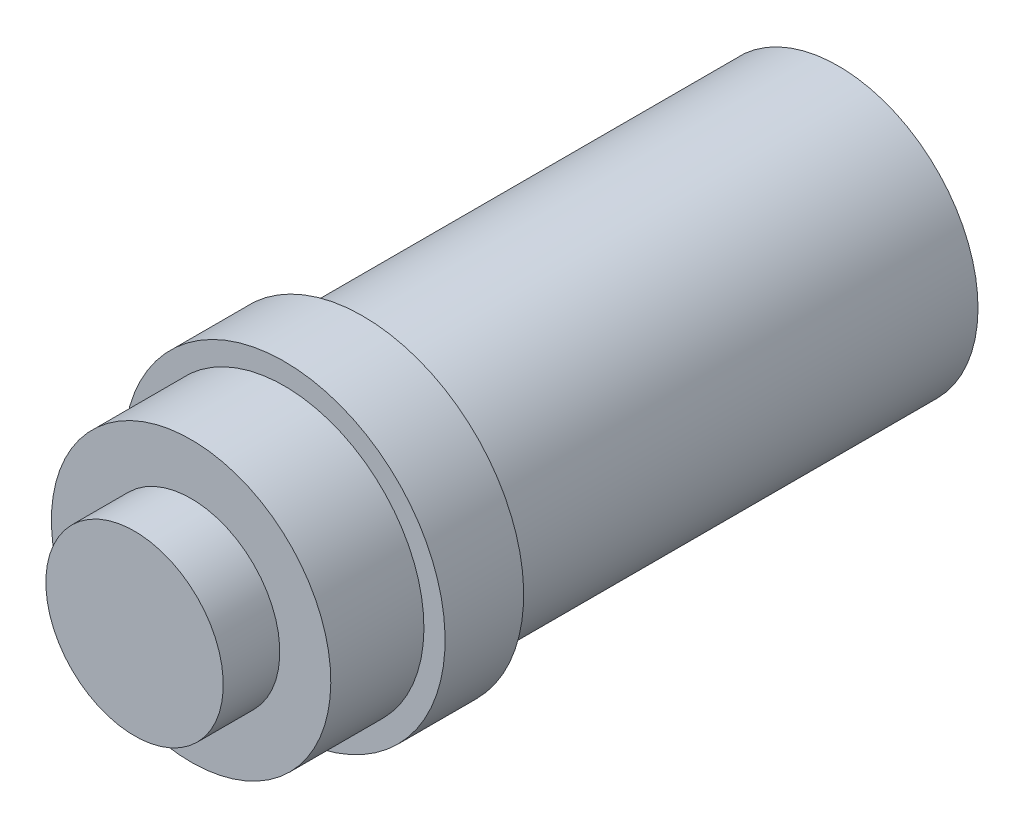
ISO-10303-21;
HEADER;
FILE_DESCRIPTION(('STEP AP214'),'2;1');
FILE_NAME('part.step','',(''),(''),'','','');
FILE_SCHEMA(('AUTOMOTIVE_DESIGN { 1 0 10303 214 1 1 1 1 }'));
ENDSEC;
DATA;
#1=APPLICATION_CONTEXT('core data for automotive mechanical design processes');
#2=APPLICATION_PROTOCOL_DEFINITION('international standard','automotive_design',2000,#1);
#3=PRODUCT_CONTEXT('',#1,'mechanical');
#4=PRODUCT('Part','Part','',(#3));
#5=PRODUCT_RELATED_PRODUCT_CATEGORY('part','',(#4));
#6=PRODUCT_DEFINITION_FORMATION('','',#4);
#7=PRODUCT_DEFINITION_CONTEXT('part definition',#1,'design');
#8=PRODUCT_DEFINITION('design','',#6,#7);
#9=PRODUCT_DEFINITION_SHAPE('','',#8);
#10=(LENGTH_UNIT() NAMED_UNIT(*) SI_UNIT(.MILLI.,.METRE.));
#11=(NAMED_UNIT(*) PLANE_ANGLE_UNIT() SI_UNIT($,.RADIAN.));
#12=(NAMED_UNIT(*) SI_UNIT($,.STERADIAN.) SOLID_ANGLE_UNIT());
#13=UNCERTAINTY_MEASURE_WITH_UNIT(LENGTH_MEASURE(1.E-05),#10,'distance_accuracy_value','');
#14=(GEOMETRIC_REPRESENTATION_CONTEXT(3) GLOBAL_UNCERTAINTY_ASSIGNED_CONTEXT((#13)) GLOBAL_UNIT_ASSIGNED_CONTEXT((#10,
#11,#12)) REPRESENTATION_CONTEXT('',''));
#15=CARTESIAN_POINT('',(0.,0.,0.));
#16=DIRECTION('',(0.,0.,1.));
#17=DIRECTION('',(1.,0.,0.));
#18=AXIS2_PLACEMENT_3D('',#15,#16,#17);
#19=CARTESIAN_POINT('',(3.36759604539927,3.36759604540067,51.9425000540002));
#20=DIRECTION('',(0.,0.,-1.));
#21=DIRECTION('',(0.707106781186549,-0.707106781186547,0.));
#22=AXIS2_PLACEMENT_3D('',#19,#20,#21);
#23=PLANE('',#22);
#24=CARTESIAN_POINT('',(-1.66533453693774E-12,-2.63677968348475E-13,51.9425000540002));
#25=DIRECTION('',(0.,0.,-1.));
#26=DIRECTION('',(0.707106781186549,-0.707106781186547,0.));
#27=AXIS2_PLACEMENT_3D('',#24,#25,#26);
#28=CIRCLE('',#27,4.7625);
#29=CARTESIAN_POINT('',(3.36759604539927,-3.36759604540119,51.9425000540002));
#30=VERTEX_POINT('',#29);
#31=EDGE_CURVE('E10',#30,#30,#28,.T.);
#32=ORIENTED_EDGE('',*,*,#31,.T.);
#33=EDGE_LOOP('',(#32));
#34=FACE_BOUND('',#33,.T.);
#35=CARTESIAN_POINT('',(-1.66533453693774E-12,-2.63677968348475E-13,51.9425000540002));
#36=DIRECTION('',(0.,0.,-1.));
#37=DIRECTION('',(0.707106781186549,-0.707106781186547,0.));
#38=AXIS2_PLACEMENT_3D('',#35,#36,#37);
#39=CIRCLE('',#38,7.499999986);
#40=CARTESIAN_POINT('',(5.30330084899796,-5.30330084899987,51.9425000540002));
#41=VERTEX_POINT('',#40);
#42=EDGE_CURVE('E54',#41,#41,#39,.T.);
#43=ORIENTED_EDGE('',*,*,#42,.F.);
#44=EDGE_LOOP('',(#43));
#45=FACE_BOUND('',#44,.T.);
#46=ADVANCED_FACE('F15',(#34,#45),#23,.F.);
#47=CARTESIAN_POINT('',(6.10657416232535,6.10657416232677,46.9425001480002));
#48=DIRECTION('',(0.,0.,-1.));
#49=DIRECTION('',(0.707106781186549,-0.707106781186547,0.));
#50=AXIS2_PLACEMENT_3D('',#47,#48,#49);
#51=PLANE('',#50);
#52=CARTESIAN_POINT('',(-1.66533453693774E-12,-2.63677968348475E-13,46.9425001480002));
#53=DIRECTION('',(0.,0.,-1.));
#54=DIRECTION('',(0.707106781186549,-0.707106781186547,0.));
#55=AXIS2_PLACEMENT_3D('',#52,#53,#54);
#56=CIRCLE('',#55,7.499999986);
#57=CARTESIAN_POINT('',(5.30330084899796,-5.30330084899987,46.9425001480002));
#58=VERTEX_POINT('',#57);
#59=EDGE_CURVE('E51',#58,#58,#56,.T.);
#60=ORIENTED_EDGE('',*,*,#59,.T.);
#61=EDGE_LOOP('',(#60));
#62=FACE_BOUND('',#61,.T.);
#63=CARTESIAN_POINT('',(-1.66533453693774E-12,-2.63677968348475E-13,46.9425001480002));
#64=DIRECTION('',(0.,0.,-1.));
#65=DIRECTION('',(0.707106781186549,-0.707106781186547,0.));
#66=AXIS2_PLACEMENT_3D('',#63,#64,#65);
#67=CIRCLE('',#66,8.636);
#68=CARTESIAN_POINT('',(6.10657416232537,-6.10657416232728,46.9425001480002));
#69=VERTEX_POINT('',#68);
#70=EDGE_CURVE('E47',#69,#69,#67,.T.);
#71=ORIENTED_EDGE('',*,*,#70,.F.);
#72=EDGE_LOOP('',(#71));
#73=FACE_BOUND('',#72,.T.);
#74=ADVANCED_FACE('F62',(#62,#73),#51,.F.);
#75=CARTESIAN_POINT('',(6.10657416232535,6.10657416232677,42.7235997720002));
#76=DIRECTION('',(0.,0.,1.));
#77=DIRECTION('',(-0.707106781186549,0.707106781186547,0.));
#78=AXIS2_PLACEMENT_3D('',#75,#76,#77);
#79=PLANE('',#78);
#80=CARTESIAN_POINT('',(-1.66533453693774E-12,-2.63677968348475E-13,42.7235997720002));
#81=DIRECTION('',(0.,0.,-1.));
#82=DIRECTION('',(0.707106781186549,-0.707106781186547,0.));
#83=AXIS2_PLACEMENT_3D('',#80,#81,#82);
#84=CIRCLE('',#83,8.636);
#85=CARTESIAN_POINT('',(6.10657416232537,-6.10657416232728,42.7235997720002));
#86=VERTEX_POINT('',#85);
#87=EDGE_CURVE('E44',#86,#86,#84,.T.);
#88=ORIENTED_EDGE('',*,*,#87,.T.);
#89=EDGE_LOOP('',(#88));
#90=FACE_BOUND('',#89,.T.);
#91=CARTESIAN_POINT('',(-1.66533453693774E-12,-2.63677968348475E-13,42.7235997720002));
#92=DIRECTION('',(0.,0.,-1.));
#93=DIRECTION('',(0.707106781186549,-0.707106781186547,0.));
#94=AXIS2_PLACEMENT_3D('',#91,#92,#93);
#95=CIRCLE('',#94,7.499999986);
#96=CARTESIAN_POINT('',(5.30330084899796,-5.30330084899987,42.7235997720002));
#97=VERTEX_POINT('',#96);
#98=EDGE_CURVE('E39',#97,#97,#95,.T.);
#99=ORIENTED_EDGE('',*,*,#98,.F.);
#100=EDGE_LOOP('',(#99));
#101=FACE_BOUND('',#100,.T.);
#102=ADVANCED_FACE('F66',(#90,#101),#79,.F.);
#103=CARTESIAN_POINT('',(5.30330084899794,5.30330084899935,17.1965997720002));
#104=DIRECTION('',(0.,0.,1.));
#105=DIRECTION('',(-0.707106781186549,0.707106781186547,0.));
#106=AXIS2_PLACEMENT_3D('',#103,#104,#105);
#107=PLANE('',#106);
#108=CARTESIAN_POINT('',(-1.66533453693774E-12,-2.63677968348475E-13,17.1965997720002));
#109=DIRECTION('',(0.,0.,-1.));
#110=DIRECTION('',(0.707106781186549,-0.707106781186547,0.));
#111=AXIS2_PLACEMENT_3D('',#108,#109,#110);
#112=CIRCLE('',#111,7.499999986);
#113=CARTESIAN_POINT('',(5.30330084899796,-5.30330084899987,17.1965997720002));
#114=VERTEX_POINT('',#113);
#115=EDGE_CURVE('E30',#114,#114,#112,.T.);
#116=ORIENTED_EDGE('',*,*,#115,.T.);
#117=EDGE_LOOP('',(#116));
#118=FACE_BOUND('',#117,.T.);
#119=ADVANCED_FACE('F70',(#118),#107,.F.);
#120=CARTESIAN_POINT('',(3.36759604539927,3.36759604540067,54.9783001800002));
#121=DIRECTION('',(0.,0.,-1.));
#122=DIRECTION('',(0.707106781186549,-0.707106781186547,0.));
#123=AXIS2_PLACEMENT_3D('',#120,#121,#122);
#124=PLANE('',#123);
#125=CARTESIAN_POINT('',(-1.66533453693774E-12,-2.63677968348475E-13,54.9783001800002));
#126=DIRECTION('',(0.,0.,-1.));
#127=DIRECTION('',(0.707106781186549,-0.707106781186547,0.));
#128=AXIS2_PLACEMENT_3D('',#125,#126,#127);
#129=CIRCLE('',#128,4.7625);
#130=CARTESIAN_POINT('',(3.36759604539927,-3.36759604540119,54.9783001800002));
#131=VERTEX_POINT('',#130);
#132=EDGE_CURVE('E22',#131,#131,#129,.T.);
#133=ORIENTED_EDGE('',*,*,#132,.F.);
#134=EDGE_LOOP('',(#133));
#135=FACE_BOUND('',#134,.T.);
#136=ADVANCED_FACE('F85',(#135),#124,.F.);
#137=CARTESIAN_POINT('',(-1.66533453693774E-12,-2.63677968348475E-13,33.7065997720002));
#138=DIRECTION('',(0.,0.,-1.));
#139=DIRECTION('',(0.707106781186549,-0.707106781186547,0.));
#140=AXIS2_PLACEMENT_3D('',#137,#138,#139);
#141=CYLINDRICAL_SURFACE('',#140,4.7625);
#142=ORIENTED_EDGE('',*,*,#31,.F.);
#143=EDGE_LOOP('',(#142));
#144=FACE_BOUND('',#143,.T.);
#145=ORIENTED_EDGE('',*,*,#132,.T.);
#146=EDGE_LOOP('',(#145));
#147=FACE_BOUND('',#146,.T.);
#148=ADVANCED_FACE('F89',(#144,#147),#141,.T.);
#149=CARTESIAN_POINT('',(-1.66533453693774E-12,-2.63677968348475E-13,33.7065997720002));
#150=DIRECTION('',(0.,0.,-1.));
#151=DIRECTION('',(0.707106781186549,-0.707106781186547,0.));
#152=AXIS2_PLACEMENT_3D('',#149,#150,#151);
#153=CYLINDRICAL_SURFACE('',#152,7.499999986);
#154=ORIENTED_EDGE('',*,*,#115,.F.);
#155=EDGE_LOOP('',(#154));
#156=FACE_BOUND('',#155,.T.);
#157=ORIENTED_EDGE('',*,*,#98,.T.);
#158=EDGE_LOOP('',(#157));
#159=FACE_BOUND('',#158,.T.);
#160=ADVANCED_FACE('F77',(#156,#159),#153,.T.);
#161=CARTESIAN_POINT('',(-1.66533453693774E-12,-2.63677968348475E-13,33.7065997720002));
#162=DIRECTION('',(0.,0.,-1.));
#163=DIRECTION('',(0.707106781186549,-0.707106781186547,0.));
#164=AXIS2_PLACEMENT_3D('',#161,#162,#163);
#165=CYLINDRICAL_SURFACE('',#164,8.636);
#166=ORIENTED_EDGE('',*,*,#87,.F.);
#167=EDGE_LOOP('',(#166));
#168=FACE_BOUND('',#167,.T.);
#169=ORIENTED_EDGE('',*,*,#70,.T.);
#170=EDGE_LOOP('',(#169));
#171=FACE_BOUND('',#170,.T.);
#172=ADVANCED_FACE('F75',(#168,#171),#165,.T.);
#173=ORIENTED_EDGE('',*,*,#59,.F.);
#174=EDGE_LOOP('',(#173));
#175=FACE_BOUND('',#174,.T.);
#176=ORIENTED_EDGE('',*,*,#42,.T.);
#177=EDGE_LOOP('',(#176));
#178=FACE_BOUND('',#177,.T.);
#179=ADVANCED_FACE('F59',(#175,#178),#153,.T.);
#180=CLOSED_SHELL('',(#46,#74,#102,#119,#136,#148,#160,#172,#179));
#181=MANIFOLD_SOLID_BREP('B1',#180);
#182=ADVANCED_BREP_SHAPE_REPRESENTATION('',(#18,#181),#14);
#183=SHAPE_DEFINITION_REPRESENTATION(#9,#182);
ENDSEC;
END-ISO-10303-21;
